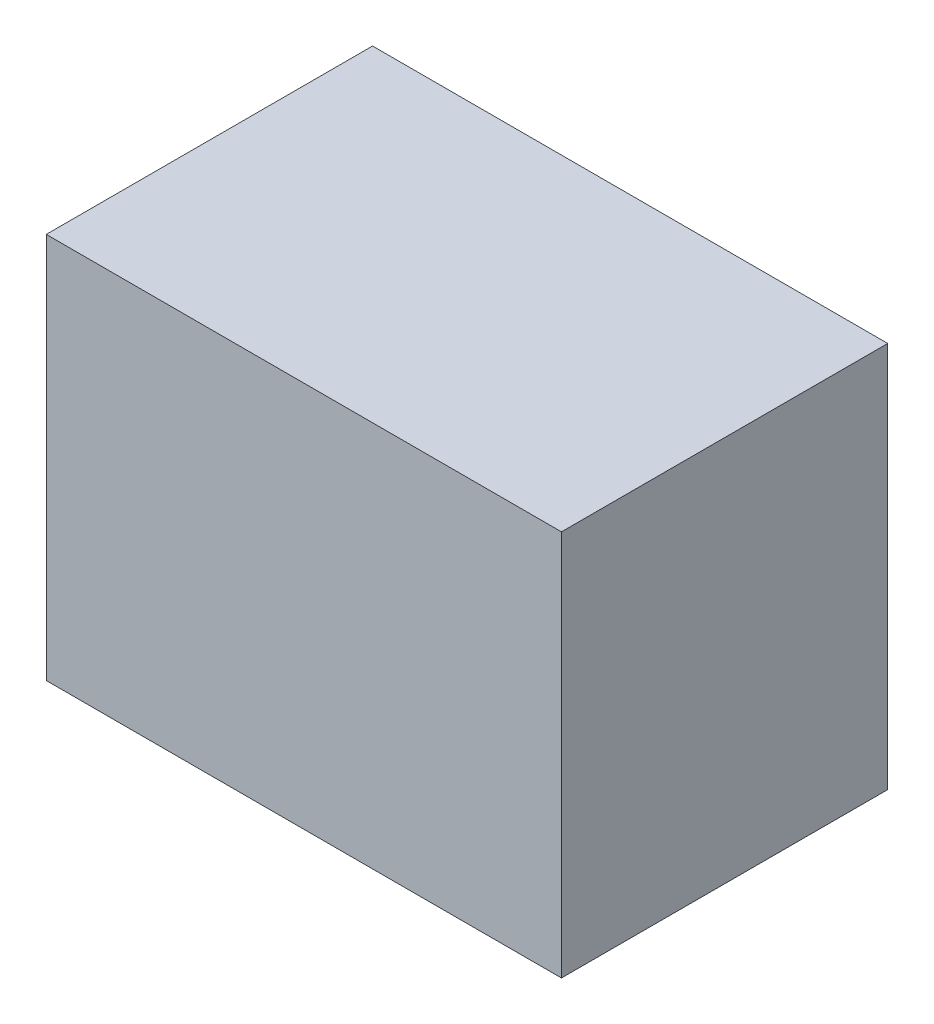
ISO-10303-21;
HEADER;
FILE_DESCRIPTION(('STEP AP214'),'2;1');
FILE_NAME('part.step','',(''),(''),'','','');
FILE_SCHEMA(('AUTOMOTIVE_DESIGN { 1 0 10303 214 1 1 1 1 }'));
ENDSEC;
DATA;
#1=APPLICATION_CONTEXT('core data for automotive mechanical design processes');
#2=APPLICATION_PROTOCOL_DEFINITION('international standard','automotive_design',2000,#1);
#3=PRODUCT_CONTEXT('',#1,'mechanical');
#4=PRODUCT('Part','Part','',(#3));
#5=PRODUCT_RELATED_PRODUCT_CATEGORY('part','',(#4));
#6=PRODUCT_DEFINITION_FORMATION('','',#4);
#7=PRODUCT_DEFINITION_CONTEXT('part definition',#1,'design');
#8=PRODUCT_DEFINITION('design','',#6,#7);
#9=PRODUCT_DEFINITION_SHAPE('','',#8);
#10=(LENGTH_UNIT() NAMED_UNIT(*) SI_UNIT(.MILLI.,.METRE.));
#11=(NAMED_UNIT(*) PLANE_ANGLE_UNIT() SI_UNIT($,.RADIAN.));
#12=(NAMED_UNIT(*) SI_UNIT($,.STERADIAN.) SOLID_ANGLE_UNIT());
#13=UNCERTAINTY_MEASURE_WITH_UNIT(LENGTH_MEASURE(1.E-05),#10,'distance_accuracy_value','');
#14=(GEOMETRIC_REPRESENTATION_CONTEXT(3) GLOBAL_UNCERTAINTY_ASSIGNED_CONTEXT((#13)) GLOBAL_UNIT_ASSIGNED_CONTEXT((#10,
#11,#12)) REPRESENTATION_CONTEXT('',''));
#15=CARTESIAN_POINT('',(0.,0.,0.));
#16=DIRECTION('',(0.,0.,1.));
#17=DIRECTION('',(1.,0.,0.));
#18=AXIS2_PLACEMENT_3D('',#15,#16,#17);
#19=CARTESIAN_POINT('',(36.424987632969,21.024999198242,1.5199995));
#20=DIRECTION('',(0.,0.,1.));
#21=DIRECTION('',(1.,0.,0.));
#22=AXIS2_PLACEMENT_3D('',#19,#20,#21);
#23=PLANE('',#22);
#24=DIRECTION('',(0.,1.,0.));
#25=VECTOR('',#24,1.);
#26=CARTESIAN_POINT('',(37.624987772969,20.124999728242,1.5199995));
#27=LINE('',#26,#25);
#28=CARTESIAN_POINT('',(37.624987772969,20.124999728242,1.5199995));
#29=VERTEX_POINT('',#28);
#30=CARTESIAN_POINT('',(37.624987772969,21.924998668242,1.5199995));
#31=VERTEX_POINT('',#30);
#32=EDGE_CURVE('E76',#29,#31,#27,.T.);
#33=ORIENTED_EDGE('',*,*,#32,.T.);
#34=DIRECTION('',(1.,0.,0.));
#35=VECTOR('',#34,1.);
#36=CARTESIAN_POINT('',(37.624987772969,21.924998668242,1.5199995));
#37=LINE('',#36,#35);
#38=CARTESIAN_POINT('',(35.224987492969,21.924998668242,1.5199995));
#39=VERTEX_POINT('',#38);
#40=EDGE_CURVE('E58',#31,#39,#37,.F.);
#41=ORIENTED_EDGE('',*,*,#40,.T.);
#42=DIRECTION('',(0.,1.,0.));
#43=VECTOR('',#42,1.);
#44=CARTESIAN_POINT('',(35.224987492969,21.924998668242,1.5199995));
#45=LINE('',#44,#43);
#46=CARTESIAN_POINT('',(35.224987492969,20.124999728242,1.5199995));
#47=VERTEX_POINT('',#46);
#48=EDGE_CURVE('E20',#39,#47,#45,.F.);
#49=ORIENTED_EDGE('',*,*,#48,.T.);
#50=DIRECTION('',(1.,0.,0.));
#51=VECTOR('',#50,1.);
#52=CARTESIAN_POINT('',(35.224987492969,20.124999728242,1.5199995));
#53=LINE('',#52,#51);
#54=EDGE_CURVE('E55',#47,#29,#53,.T.);
#55=ORIENTED_EDGE('',*,*,#54,.T.);
#56=EDGE_LOOP('',(#33,#41,#49,#55));
#57=FACE_BOUND('',#56,.T.);
#58=ADVANCED_FACE('F17',(#57),#23,.T.);
#59=CARTESIAN_POINT('',(35.224987492969,21.924998668242,0.));
#60=DIRECTION('',(1.,0.,0.));
#61=DIRECTION('',(0.,0.,-1.));
#62=AXIS2_PLACEMENT_3D('',#59,#60,#61);
#63=PLANE('',#62);
#64=DIRECTION('',(0.,0.,1.));
#65=VECTOR('',#64,1.);
#66=CARTESIAN_POINT('',(35.224987492969,20.124999728242,0.));
#67=LINE('',#66,#65);
#68=CARTESIAN_POINT('',(35.224987492969,20.124999728242,0.));
#69=VERTEX_POINT('',#68);
#70=EDGE_CURVE('E63',#69,#47,#67,.T.);
#71=ORIENTED_EDGE('',*,*,#70,.T.);
#72=ORIENTED_EDGE('',*,*,#48,.F.);
#73=DIRECTION('',(0.,0.,-1.));
#74=VECTOR('',#73,1.);
#75=CARTESIAN_POINT('',(35.224987492969,21.924998668242,0.));
#76=LINE('',#75,#74);
#77=CARTESIAN_POINT('',(35.224987492969,21.924998668242,0.));
#78=VERTEX_POINT('',#77);
#79=EDGE_CURVE('E80',#39,#78,#76,.T.);
#80=ORIENTED_EDGE('',*,*,#79,.T.);
#81=DIRECTION('',(0.,1.,0.));
#82=VECTOR('',#81,1.);
#83=CARTESIAN_POINT('',(35.224987492969,21.024999198242,0.));
#84=LINE('',#83,#82);
#85=EDGE_CURVE('E73',#78,#69,#84,.F.);
#86=ORIENTED_EDGE('',*,*,#85,.T.);
#87=EDGE_LOOP('',(#71,#72,#80,#86));
#88=FACE_BOUND('',#87,.T.);
#89=ADVANCED_FACE('F72',(#88),#63,.F.);
#90=CARTESIAN_POINT('',(35.224987492969,20.124999728242,0.));
#91=DIRECTION('',(0.,1.,0.));
#92=DIRECTION('',(0.,0.,1.));
#93=AXIS2_PLACEMENT_3D('',#90,#91,#92);
#94=PLANE('',#93);
#95=DIRECTION('',(0.,0.,1.));
#96=VECTOR('',#95,1.);
#97=CARTESIAN_POINT('',(37.624987772969,20.124999728242,0.));
#98=LINE('',#97,#96);
#99=CARTESIAN_POINT('',(37.624987772969,20.124999728242,0.));
#100=VERTEX_POINT('',#99);
#101=EDGE_CURVE('E69',#100,#29,#98,.T.);
#102=ORIENTED_EDGE('',*,*,#101,.T.);
#103=ORIENTED_EDGE('',*,*,#54,.F.);
#104=ORIENTED_EDGE('',*,*,#70,.F.);
#105=DIRECTION('',(1.,0.,0.));
#106=VECTOR('',#105,1.);
#107=CARTESIAN_POINT('',(36.424987632969,20.124999728242,0.));
#108=LINE('',#107,#106);
#109=EDGE_CURVE('E83',#69,#100,#108,.T.);
#110=ORIENTED_EDGE('',*,*,#109,.T.);
#111=EDGE_LOOP('',(#102,#103,#104,#110));
#112=FACE_BOUND('',#111,.T.);
#113=ADVANCED_FACE('F66',(#112),#94,.F.);
#114=CARTESIAN_POINT('',(37.624987772969,20.124999728242,0.));
#115=DIRECTION('',(-1.,0.,0.));
#116=DIRECTION('',(0.,0.,1.));
#117=AXIS2_PLACEMENT_3D('',#114,#115,#116);
#118=PLANE('',#117);
#119=DIRECTION('',(0.,0.,-1.));
#120=VECTOR('',#119,1.);
#121=CARTESIAN_POINT('',(37.624987772969,21.924998668242,0.));
#122=LINE('',#121,#120);
#123=CARTESIAN_POINT('',(37.624987772969,21.924998668242,0.));
#124=VERTEX_POINT('',#123);
#125=EDGE_CURVE('E34',#124,#31,#122,.F.);
#126=ORIENTED_EDGE('',*,*,#125,.T.);
#127=ORIENTED_EDGE('',*,*,#32,.F.);
#128=ORIENTED_EDGE('',*,*,#101,.F.);
#129=DIRECTION('',(0.,1.,0.));
#130=VECTOR('',#129,1.);
#131=CARTESIAN_POINT('',(37.624987772969,21.024999198242,0.));
#132=LINE('',#131,#130);
#133=EDGE_CURVE('E26',#100,#124,#132,.T.);
#134=ORIENTED_EDGE('',*,*,#133,.T.);
#135=EDGE_LOOP('',(#126,#127,#128,#134));
#136=FACE_BOUND('',#135,.T.);
#137=ADVANCED_FACE('F88',(#136),#118,.F.);
#138=CARTESIAN_POINT('',(37.624987772969,21.924998668242,0.));
#139=DIRECTION('',(0.,-1.,0.));
#140=DIRECTION('',(0.,0.,-1.));
#141=AXIS2_PLACEMENT_3D('',#138,#139,#140);
#142=PLANE('',#141);
#143=ORIENTED_EDGE('',*,*,#79,.F.);
#144=ORIENTED_EDGE('',*,*,#40,.F.);
#145=ORIENTED_EDGE('',*,*,#125,.F.);
#146=DIRECTION('',(1.,0.,0.));
#147=VECTOR('',#146,1.);
#148=CARTESIAN_POINT('',(36.424987632969,21.924998668242,0.));
#149=LINE('',#148,#147);
#150=EDGE_CURVE('E11',#124,#78,#149,.F.);
#151=ORIENTED_EDGE('',*,*,#150,.T.);
#152=EDGE_LOOP('',(#143,#144,#145,#151));
#153=FACE_BOUND('',#152,.T.);
#154=ADVANCED_FACE('F91',(#153),#142,.F.);
#155=CARTESIAN_POINT('',(36.424987632969,21.024999198242,0.));
#156=DIRECTION('',(0.,0.,1.));
#157=DIRECTION('',(1.,0.,0.));
#158=AXIS2_PLACEMENT_3D('',#155,#156,#157);
#159=PLANE('',#158);
#160=ORIENTED_EDGE('',*,*,#133,.F.);
#161=ORIENTED_EDGE('',*,*,#109,.F.);
#162=ORIENTED_EDGE('',*,*,#85,.F.);
#163=ORIENTED_EDGE('',*,*,#150,.F.);
#164=EDGE_LOOP('',(#160,#161,#162,#163));
#165=FACE_BOUND('',#164,.T.);
#166=ADVANCED_FACE('F90',(#165),#159,.F.);
#167=CLOSED_SHELL('',(#58,#89,#113,#137,#154,#166));
#168=MANIFOLD_SOLID_BREP('B1',#167);
#169=ADVANCED_BREP_SHAPE_REPRESENTATION('',(#18,#168),#14);
#170=SHAPE_DEFINITION_REPRESENTATION(#9,#169);
ENDSEC;
END-ISO-10303-21;
